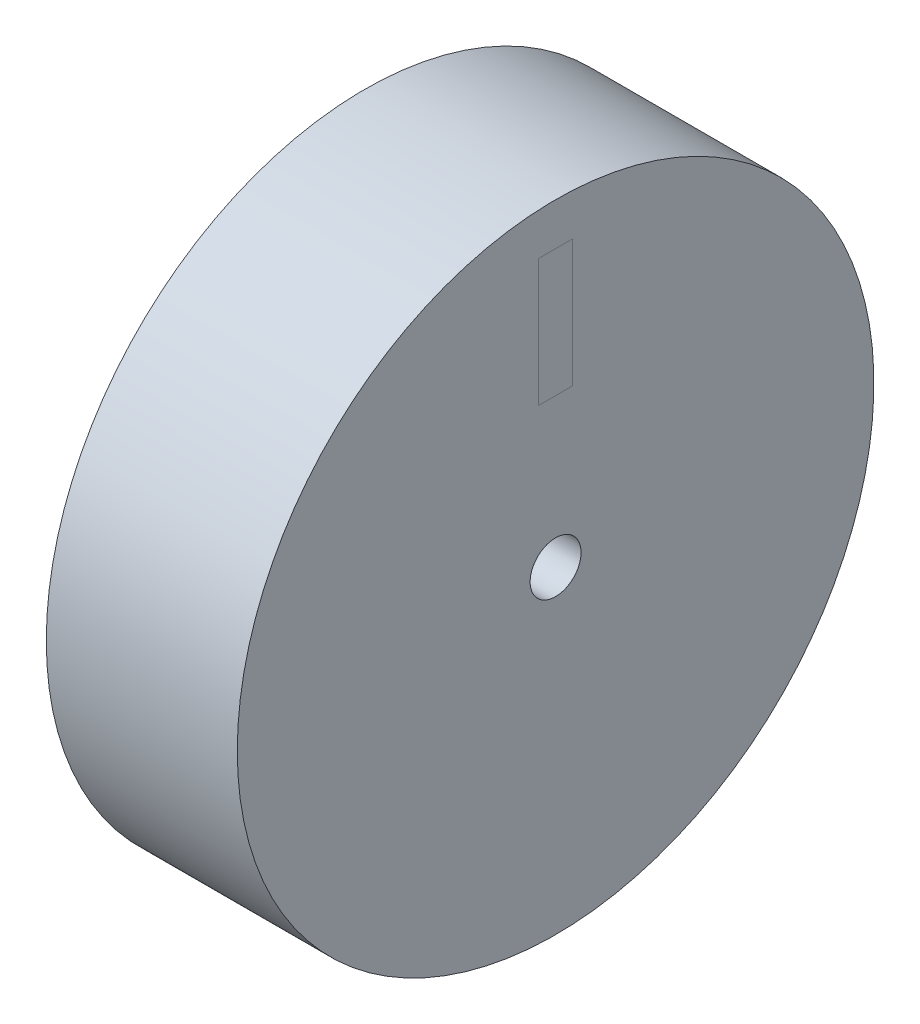
ISO-10303-21;
HEADER;
FILE_DESCRIPTION(('STEP AP214'),'2;1');
FILE_NAME('part.step','',(''),(''),'','','');
FILE_SCHEMA(('AUTOMOTIVE_DESIGN { 1 0 10303 214 1 1 1 1 }'));
ENDSEC;
DATA;
#1=APPLICATION_CONTEXT('core data for automotive mechanical design processes');
#2=APPLICATION_PROTOCOL_DEFINITION('international standard','automotive_design',2000,#1);
#3=PRODUCT_CONTEXT('',#1,'mechanical');
#4=PRODUCT('Part','Part','',(#3));
#5=PRODUCT_RELATED_PRODUCT_CATEGORY('part','',(#4));
#6=PRODUCT_DEFINITION_FORMATION('','',#4);
#7=PRODUCT_DEFINITION_CONTEXT('part definition',#1,'design');
#8=PRODUCT_DEFINITION('design','',#6,#7);
#9=PRODUCT_DEFINITION_SHAPE('','',#8);
#10=(LENGTH_UNIT() NAMED_UNIT(*) SI_UNIT(.MILLI.,.METRE.));
#11=(NAMED_UNIT(*) PLANE_ANGLE_UNIT() SI_UNIT($,.RADIAN.));
#12=(NAMED_UNIT(*) SI_UNIT($,.STERADIAN.) SOLID_ANGLE_UNIT());
#13=UNCERTAINTY_MEASURE_WITH_UNIT(LENGTH_MEASURE(1.E-05),#10,'distance_accuracy_value','');
#14=(GEOMETRIC_REPRESENTATION_CONTEXT(3) GLOBAL_UNCERTAINTY_ASSIGNED_CONTEXT((#13)) GLOBAL_UNIT_ASSIGNED_CONTEXT((#10,
#11,#12)) REPRESENTATION_CONTEXT('',''));
#15=CARTESIAN_POINT('',(0.,0.,0.));
#16=DIRECTION('',(0.,0.,1.));
#17=DIRECTION('',(1.,0.,0.));
#18=AXIS2_PLACEMENT_3D('',#15,#16,#17);
#19=CARTESIAN_POINT('',(22.5,0.,0.));
#20=DIRECTION('',(1.,0.,0.));
#21=DIRECTION('',(0.,0.,-1.));
#22=AXIS2_PLACEMENT_3D('',#19,#20,#21);
#23=PLANE('',#22);
#24=CARTESIAN_POINT('',(22.5,0.,0.));
#25=DIRECTION('',(1.,0.,0.));
#26=DIRECTION('',(0.,0.,-1.));
#27=AXIS2_PLACEMENT_3D('',#24,#25,#26);
#28=CIRCLE('',#27,75.);
#29=CARTESIAN_POINT('',(22.5,0.,75.));
#30=VERTEX_POINT('',#29);
#31=EDGE_CURVE('E78',#30,#30,#28,.T.);
#32=ORIENTED_EDGE('',*,*,#31,.T.);
#33=EDGE_LOOP('',(#32));
#34=FACE_BOUND('',#33,.T.);
#35=CARTESIAN_POINT('',(22.5,0.,0.));
#36=DIRECTION('',(1.,0.,0.));
#37=DIRECTION('',(0.,0.,-1.));
#38=AXIS2_PLACEMENT_3D('',#35,#36,#37);
#39=CIRCLE('',#38,6.);
#40=CARTESIAN_POINT('',(22.5,0.,6.));
#41=VERTEX_POINT('',#40);
#42=EDGE_CURVE('E92',#41,#41,#39,.T.);
#43=ORIENTED_EDGE('',*,*,#42,.F.);
#44=EDGE_LOOP('',(#43));
#45=FACE_BOUND('',#44,.T.);
#46=DIRECTION('',(0.,0.,-1.));
#47=VECTOR('',#46,1.);
#48=CARTESIAN_POINT('',(22.5,65.,0.));
#49=LINE('',#48,#47);
#50=CARTESIAN_POINT('',(22.5,65.,4.));
#51=VERTEX_POINT('',#50);
#52=CARTESIAN_POINT('',(22.5,65.,-4.));
#53=VERTEX_POINT('',#52);
#54=EDGE_CURVE('E58',#51,#53,#49,.T.);
#55=ORIENTED_EDGE('',*,*,#54,.T.);
#56=DIRECTION('',(0.,-1.,0.));
#57=VECTOR('',#56,1.);
#58=CARTESIAN_POINT('',(22.5,0.,-4.));
#59=LINE('',#58,#57);
#60=CARTESIAN_POINT('',(22.5,35.,-4.));
#61=VERTEX_POINT('',#60);
#62=EDGE_CURVE('E11',#53,#61,#59,.T.);
#63=ORIENTED_EDGE('',*,*,#62,.T.);
#64=DIRECTION('',(0.,0.,1.));
#65=VECTOR('',#64,1.);
#66=CARTESIAN_POINT('',(22.5,35.,0.));
#67=LINE('',#66,#65);
#68=CARTESIAN_POINT('',(22.5,35.,4.));
#69=VERTEX_POINT('',#68);
#70=EDGE_CURVE('E73',#61,#69,#67,.T.);
#71=ORIENTED_EDGE('',*,*,#70,.T.);
#72=DIRECTION('',(0.,1.,0.));
#73=VECTOR('',#72,1.);
#74=CARTESIAN_POINT('',(22.5,0.,4.));
#75=LINE('',#74,#73);
#76=EDGE_CURVE('E77',#69,#51,#75,.T.);
#77=ORIENTED_EDGE('',*,*,#76,.T.);
#78=EDGE_LOOP('',(#55,#63,#71,#77));
#79=FACE_BOUND('',#78,.T.);
#80=ADVANCED_FACE('F51',(#34,#45,#79),#23,.T.);
#81=ORIENTED_EDGE('',*,*,#62,.F.);
#82=ORIENTED_EDGE('',*,*,#54,.F.);
#83=ORIENTED_EDGE('',*,*,#76,.F.);
#84=ORIENTED_EDGE('',*,*,#70,.F.);
#85=EDGE_LOOP('',(#81,#82,#83,#84));
#86=FACE_BOUND('',#85,.T.);
#87=ADVANCED_FACE('F76',(#86),#23,.T.);
#88=CARTESIAN_POINT('',(-22.5,0.,0.));
#89=DIRECTION('',(1.,0.,0.));
#90=DIRECTION('',(0.,0.,-1.));
#91=AXIS2_PLACEMENT_3D('',#88,#89,#90);
#92=PLANE('',#91);
#93=CARTESIAN_POINT('',(-22.5,0.,0.));
#94=DIRECTION('',(1.,0.,0.));
#95=DIRECTION('',(0.,0.,-1.));
#96=AXIS2_PLACEMENT_3D('',#93,#94,#95);
#97=CIRCLE('',#96,75.);
#98=CARTESIAN_POINT('',(-22.5,0.,75.));
#99=VERTEX_POINT('',#98);
#100=EDGE_CURVE('E88',#99,#99,#97,.T.);
#101=ORIENTED_EDGE('',*,*,#100,.F.);
#102=EDGE_LOOP('',(#101));
#103=FACE_BOUND('',#102,.T.);
#104=CARTESIAN_POINT('',(-22.5,0.,0.));
#105=DIRECTION('',(1.,0.,0.));
#106=DIRECTION('',(0.,0.,-1.));
#107=AXIS2_PLACEMENT_3D('',#104,#105,#106);
#108=CIRCLE('',#107,6.);
#109=CARTESIAN_POINT('',(-22.5,0.,6.));
#110=VERTEX_POINT('',#109);
#111=EDGE_CURVE('E100',#110,#110,#108,.T.);
#112=ORIENTED_EDGE('',*,*,#111,.T.);
#113=EDGE_LOOP('',(#112));
#114=FACE_BOUND('',#113,.T.);
#115=ADVANCED_FACE('F111',(#103,#114),#92,.F.);
#116=CARTESIAN_POINT('',(22.5,0.,0.));
#117=DIRECTION('',(-1.,0.,0.));
#118=DIRECTION('',(0.,0.,1.));
#119=AXIS2_PLACEMENT_3D('',#116,#117,#118);
#120=CYLINDRICAL_SURFACE('',#119,75.);
#121=CARTESIAN_POINT('',(22.5,0.,75.));
#122=CARTESIAN_POINT('',(22.03125,0.,75.));
#123=CARTESIAN_POINT('',(21.5625,0.,75.));
#124=CARTESIAN_POINT('',(20.625,0.,75.));
#125=CARTESIAN_POINT('',(20.15625,0.,75.));
#126=CARTESIAN_POINT('',(19.21875,0.,75.));
#127=CARTESIAN_POINT('',(18.75,0.,75.));
#128=CARTESIAN_POINT('',(17.8125,0.,75.));
#129=CARTESIAN_POINT('',(17.34375,0.,75.));
#130=CARTESIAN_POINT('',(16.40625,0.,75.));
#131=CARTESIAN_POINT('',(15.9375,0.,75.));
#132=CARTESIAN_POINT('',(15.,0.,75.));
#133=CARTESIAN_POINT('',(14.53125,0.,75.));
#134=CARTESIAN_POINT('',(13.59375,0.,75.));
#135=CARTESIAN_POINT('',(13.125,0.,75.));
#136=CARTESIAN_POINT('',(12.1875,0.,75.));
#137=CARTESIAN_POINT('',(11.71875,0.,75.));
#138=CARTESIAN_POINT('',(10.78125,0.,75.));
#139=CARTESIAN_POINT('',(10.3125,0.,75.));
#140=CARTESIAN_POINT('',(9.37499999999999,0.,75.));
#141=CARTESIAN_POINT('',(8.90625,0.,75.));
#142=CARTESIAN_POINT('',(7.96874999999999,0.,75.));
#143=CARTESIAN_POINT('',(7.5,0.,75.));
#144=CARTESIAN_POINT('',(6.5625,0.,75.));
#145=CARTESIAN_POINT('',(6.09374999999999,0.,75.));
#146=CARTESIAN_POINT('',(5.15624999999999,0.,75.));
#147=CARTESIAN_POINT('',(4.68749999999999,0.,75.));
#148=CARTESIAN_POINT('',(3.74999999999999,0.,75.));
#149=CARTESIAN_POINT('',(3.28124999999999,0.,75.));
#150=CARTESIAN_POINT('',(2.34375,0.,75.));
#151=CARTESIAN_POINT('',(1.87499999999999,0.,75.));
#152=CARTESIAN_POINT('',(0.937499999999994,0.,75.));
#153=CARTESIAN_POINT('',(0.468749999999993,0.,75.));
#154=CARTESIAN_POINT('',(-0.468750000000007,0.,75.));
#155=CARTESIAN_POINT('',(-0.937500000000008,0.,75.));
#156=CARTESIAN_POINT('',(-1.87500000000001,0.,75.));
#157=CARTESIAN_POINT('',(-2.34375000000001,0.,75.));
#158=CARTESIAN_POINT('',(-3.28125000000001,0.,75.));
#159=CARTESIAN_POINT('',(-3.75000000000001,0.,75.));
#160=CARTESIAN_POINT('',(-4.68750000000001,0.,75.));
#161=CARTESIAN_POINT('',(-5.15625000000001,0.,75.));
#162=CARTESIAN_POINT('',(-6.09375000000001,0.,75.));
#163=CARTESIAN_POINT('',(-6.56250000000001,0.,75.));
#164=CARTESIAN_POINT('',(-7.50000000000001,0.,75.));
#165=CARTESIAN_POINT('',(-7.96875000000001,0.,75.));
#166=CARTESIAN_POINT('',(-8.90625000000001,0.,75.));
#167=CARTESIAN_POINT('',(-9.37500000000001,0.,75.));
#168=CARTESIAN_POINT('',(-10.3125,0.,75.));
#169=CARTESIAN_POINT('',(-10.78125,0.,75.));
#170=CARTESIAN_POINT('',(-11.71875,0.,75.));
#171=CARTESIAN_POINT('',(-12.1875,0.,75.));
#172=CARTESIAN_POINT('',(-13.125,0.,75.));
#173=CARTESIAN_POINT('',(-13.59375,0.,75.));
#174=CARTESIAN_POINT('',(-14.53125,0.,75.));
#175=CARTESIAN_POINT('',(-15.,0.,75.));
#176=CARTESIAN_POINT('',(-15.9375,0.,75.));
#177=CARTESIAN_POINT('',(-16.40625,0.,75.));
#178=CARTESIAN_POINT('',(-17.34375,0.,75.));
#179=CARTESIAN_POINT('',(-17.8125,0.,75.));
#180=CARTESIAN_POINT('',(-18.75,0.,75.));
#181=CARTESIAN_POINT('',(-19.21875,0.,75.));
#182=CARTESIAN_POINT('',(-20.15625,0.,75.));
#183=CARTESIAN_POINT('',(-20.625,0.,75.));
#184=CARTESIAN_POINT('',(-21.5625,0.,75.));
#185=CARTESIAN_POINT('',(-22.03125,0.,75.));
#186=CARTESIAN_POINT('',(-22.5,0.,75.));
#187=B_SPLINE_CURVE_WITH_KNOTS('',3,(#121,#122,#123,#124,#125,#126,#127,#128,#129,#130,#131,
#132,#133,#134,#135,#136,#137,#138,#139,#140,#141,#142,#143,#144,#145,#146,#147,#148,#149,#150,
#151,#152,#153,#154,#155,#156,#157,#158,#159,#160,#161,#162,#163,#164,#165,#166,#167,#168,#169,
#170,#171,#172,#173,#174,#175,#176,#177,#178,#179,#180,#181,#182,#183,#184,#185,#186),
.UNSPECIFIED.,.F.,.F.,(4,2,2,2,2,2,2,2,2,2,2,2,2,2,2,2,2,2,2,2,2,2,2,2,2,2,2,2,2,2,2,2,4),(0.,
1.40625,2.8125,4.21875,5.625,7.03125,8.4375,9.84375,11.25,12.65625,14.0625,15.46875,16.875,
18.28125,19.6875,21.09375,22.5,23.90625,25.3125,26.71875,28.125,29.53125,30.9375,32.34375,33.75,
35.15625,36.5625,37.96875,39.375,40.78125,42.1875,43.59375,45.),.UNSPECIFIED.);
#188=EDGE_CURVE('BSEAM52',#30,#99,#187,.T.);
#189=ORIENTED_EDGE('',*,*,#31,.F.);
#190=ORIENTED_EDGE('',*,*,#100,.T.);
#191=ORIENTED_EDGE('',*,*,#188,.T.);
#192=ORIENTED_EDGE('',*,*,#188,.F.);
#193=EDGE_LOOP('',(#189,#191,#190,#192));
#194=FACE_BOUND('',#193,.T.);
#195=ADVANCED_FACE('F52',(#194),#120,.T.);
#196=CARTESIAN_POINT('',(22.5,0.,0.));
#197=DIRECTION('',(-1.,0.,0.));
#198=DIRECTION('',(0.,0.,1.));
#199=AXIS2_PLACEMENT_3D('',#196,#197,#198);
#200=CYLINDRICAL_SURFACE('',#199,6.);
#201=CARTESIAN_POINT('',(22.5,0.,6.));
#202=CARTESIAN_POINT('',(22.03125,0.,6.));
#203=CARTESIAN_POINT('',(21.5625,0.,6.));
#204=CARTESIAN_POINT('',(20.625,0.,6.));
#205=CARTESIAN_POINT('',(20.15625,0.,6.));
#206=CARTESIAN_POINT('',(19.21875,0.,6.));
#207=CARTESIAN_POINT('',(18.75,0.,6.));
#208=CARTESIAN_POINT('',(17.8125,0.,6.));
#209=CARTESIAN_POINT('',(17.34375,0.,6.));
#210=CARTESIAN_POINT('',(16.40625,0.,6.));
#211=CARTESIAN_POINT('',(15.9375,0.,6.));
#212=CARTESIAN_POINT('',(15.,0.,6.));
#213=CARTESIAN_POINT('',(14.53125,0.,6.));
#214=CARTESIAN_POINT('',(13.59375,0.,6.));
#215=CARTESIAN_POINT('',(13.125,0.,6.));
#216=CARTESIAN_POINT('',(12.1875,0.,6.));
#217=CARTESIAN_POINT('',(11.71875,0.,6.));
#218=CARTESIAN_POINT('',(10.78125,0.,6.));
#219=CARTESIAN_POINT('',(10.3125,0.,6.));
#220=CARTESIAN_POINT('',(9.37499999999999,0.,6.));
#221=CARTESIAN_POINT('',(8.90625,0.,6.));
#222=CARTESIAN_POINT('',(7.96874999999999,0.,6.));
#223=CARTESIAN_POINT('',(7.5,0.,6.));
#224=CARTESIAN_POINT('',(6.5625,0.,6.));
#225=CARTESIAN_POINT('',(6.09375,0.,6.));
#226=CARTESIAN_POINT('',(5.15625,0.,6.));
#227=CARTESIAN_POINT('',(4.6875,0.,6.));
#228=CARTESIAN_POINT('',(3.75,0.,6.));
#229=CARTESIAN_POINT('',(3.28125,0.,6.));
#230=CARTESIAN_POINT('',(2.34375,0.,6.));
#231=CARTESIAN_POINT('',(1.875,0.,6.));
#232=CARTESIAN_POINT('',(0.937499999999997,0.,6.));
#233=CARTESIAN_POINT('',(0.468749999999997,0.,6.));
#234=CARTESIAN_POINT('',(-0.468750000000004,0.,6.));
#235=CARTESIAN_POINT('',(-0.937500000000004,0.,6.));
#236=CARTESIAN_POINT('',(-1.87500000000001,0.,6.));
#237=CARTESIAN_POINT('',(-2.34375000000001,0.,6.));
#238=CARTESIAN_POINT('',(-3.28125,0.,6.));
#239=CARTESIAN_POINT('',(-3.75,0.,6.));
#240=CARTESIAN_POINT('',(-4.6875,0.,6.));
#241=CARTESIAN_POINT('',(-5.15625,0.,6.));
#242=CARTESIAN_POINT('',(-6.09375000000001,0.,6.));
#243=CARTESIAN_POINT('',(-6.56250000000001,0.,6.));
#244=CARTESIAN_POINT('',(-7.50000000000001,0.,6.));
#245=CARTESIAN_POINT('',(-7.96875000000001,0.,6.));
#246=CARTESIAN_POINT('',(-8.90625,0.,6.));
#247=CARTESIAN_POINT('',(-9.37500000000001,0.,6.));
#248=CARTESIAN_POINT('',(-10.3125,0.,6.));
#249=CARTESIAN_POINT('',(-10.78125,0.,6.));
#250=CARTESIAN_POINT('',(-11.71875,0.,6.));
#251=CARTESIAN_POINT('',(-12.1875,0.,6.));
#252=CARTESIAN_POINT('',(-13.125,0.,6.));
#253=CARTESIAN_POINT('',(-13.59375,0.,6.));
#254=CARTESIAN_POINT('',(-14.53125,0.,6.));
#255=CARTESIAN_POINT('',(-15.,0.,6.));
#256=CARTESIAN_POINT('',(-15.9375,0.,6.));
#257=CARTESIAN_POINT('',(-16.40625,0.,6.));
#258=CARTESIAN_POINT('',(-17.34375,0.,6.));
#259=CARTESIAN_POINT('',(-17.8125,0.,6.));
#260=CARTESIAN_POINT('',(-18.75,0.,6.));
#261=CARTESIAN_POINT('',(-19.21875,0.,6.));
#262=CARTESIAN_POINT('',(-20.15625,0.,6.));
#263=CARTESIAN_POINT('',(-20.625,0.,6.));
#264=CARTESIAN_POINT('',(-21.5625,0.,6.));
#265=CARTESIAN_POINT('',(-22.03125,0.,6.));
#266=CARTESIAN_POINT('',(-22.5,0.,6.));
#267=B_SPLINE_CURVE_WITH_KNOTS('',3,(#201,#202,#203,#204,#205,#206,#207,#208,#209,#210,#211,
#212,#213,#214,#215,#216,#217,#218,#219,#220,#221,#222,#223,#224,#225,#226,#227,#228,#229,#230,
#231,#232,#233,#234,#235,#236,#237,#238,#239,#240,#241,#242,#243,#244,#245,#246,#247,#248,#249,
#250,#251,#252,#253,#254,#255,#256,#257,#258,#259,#260,#261,#262,#263,#264,#265,#266),
.UNSPECIFIED.,.F.,.F.,(4,2,2,2,2,2,2,2,2,2,2,2,2,2,2,2,2,2,2,2,2,2,2,2,2,2,2,2,2,2,2,2,4),(0.,
1.40625,2.8125,4.21875,5.625,7.03125,8.4375,9.84375,11.25,12.65625,14.0625,15.46875,16.875,
18.28125,19.6875,21.09375,22.5,23.90625,25.3125,26.71875,28.125,29.53125,30.9375,32.34375,33.75,
35.15625,36.5625,37.96875,39.375,40.78125,42.1875,43.59375,45.),.UNSPECIFIED.);
#268=EDGE_CURVE('BSEAM103',#41,#110,#267,.T.);
#269=ORIENTED_EDGE('',*,*,#42,.T.);
#270=ORIENTED_EDGE('',*,*,#111,.F.);
#271=ORIENTED_EDGE('',*,*,#268,.T.);
#272=ORIENTED_EDGE('',*,*,#268,.F.);
#273=EDGE_LOOP('',(#269,#271,#270,#272));
#274=FACE_BOUND('',#273,.T.);
#275=ADVANCED_FACE('F103',(#274),#200,.F.);
#276=CLOSED_SHELL('',(#80,#87,#115,#195,#275));
#277=MANIFOLD_SOLID_BREP('B2',#276);
#278=ADVANCED_BREP_SHAPE_REPRESENTATION('',(#18,#277),#14);
#279=SHAPE_DEFINITION_REPRESENTATION(#9,#278);
ENDSEC;
END-ISO-10303-21;
